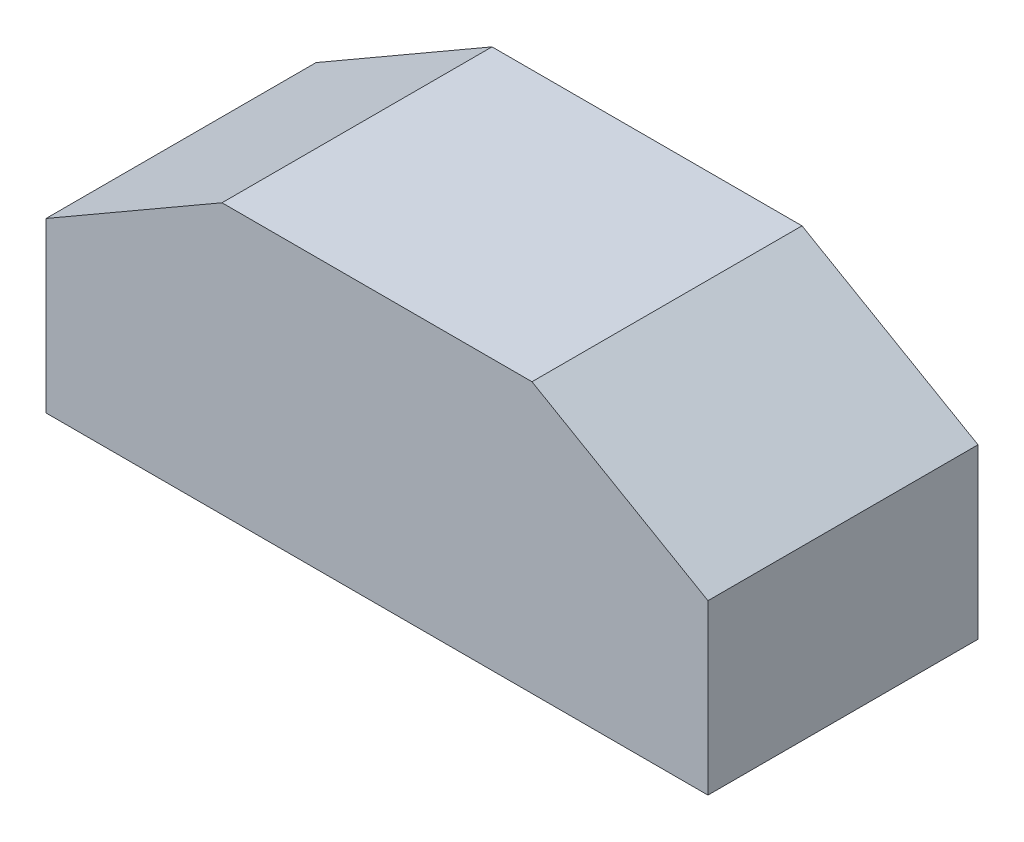
ISO-10303-21;
HEADER;
FILE_DESCRIPTION(('STEP AP214'),'2;1');
FILE_NAME('part.step','',(''),(''),'','','');
FILE_SCHEMA(('AUTOMOTIVE_DESIGN { 1 0 10303 214 1 1 1 1 }'));
ENDSEC;
DATA;
#1=APPLICATION_CONTEXT('core data for automotive mechanical design processes');
#2=APPLICATION_PROTOCOL_DEFINITION('international standard','automotive_design',2000,#1);
#3=PRODUCT_CONTEXT('',#1,'mechanical');
#4=PRODUCT('Part','Part','',(#3));
#5=PRODUCT_RELATED_PRODUCT_CATEGORY('part','',(#4));
#6=PRODUCT_DEFINITION_FORMATION('','',#4);
#7=PRODUCT_DEFINITION_CONTEXT('part definition',#1,'design');
#8=PRODUCT_DEFINITION('design','',#6,#7);
#9=PRODUCT_DEFINITION_SHAPE('','',#8);
#10=(LENGTH_UNIT() NAMED_UNIT(*) SI_UNIT(.MILLI.,.METRE.));
#11=(NAMED_UNIT(*) PLANE_ANGLE_UNIT() SI_UNIT($,.RADIAN.));
#12=(NAMED_UNIT(*) SI_UNIT($,.STERADIAN.) SOLID_ANGLE_UNIT());
#13=UNCERTAINTY_MEASURE_WITH_UNIT(LENGTH_MEASURE(1.E-05),#10,'distance_accuracy_value','');
#14=(GEOMETRIC_REPRESENTATION_CONTEXT(3) GLOBAL_UNCERTAINTY_ASSIGNED_CONTEXT((#13)) GLOBAL_UNIT_ASSIGNED_CONTEXT((#10,
#11,#12)) REPRESENTATION_CONTEXT('',''));
#15=CARTESIAN_POINT('',(0.,0.,0.));
#16=DIRECTION('',(0.,0.,1.));
#17=DIRECTION('',(1.,0.,0.));
#18=AXIS2_PLACEMENT_3D('',#15,#16,#17);
#19=CARTESIAN_POINT('',(3.74999999999992,6.49519052838325,10.));
#20=DIRECTION('',(0.499999999999995,0.866025403784442,0.));
#21=DIRECTION('',(-0.866025403784442,0.499999999999995,0.));
#22=AXIS2_PLACEMENT_3D('',#19,#20,#21);
#23=PLANE('',#22);
#24=DIRECTION('',(0.866025403784442,-0.499999999999995,0.));
#25=VECTOR('',#24,1.);
#26=CARTESIAN_POINT('',(3.74999999999992,6.49519052838325,0.));
#27=LINE('',#26,#25);
#28=CARTESIAN_POINT('',(15.,0.,0.));
#29=VERTEX_POINT('',#28);
#30=CARTESIAN_POINT('',(23.6602540378444,-4.99999999999995,0.));
#31=VERTEX_POINT('',#30);
#32=EDGE_CURVE('E163',#29,#31,#27,.T.);
#33=ORIENTED_EDGE('',*,*,#32,.T.);
#34=DIRECTION('',(0.,0.,-1.));
#35=VECTOR('',#34,1.);
#36=CARTESIAN_POINT('',(23.6602540378444,-4.99999999999995,10.));
#37=LINE('',#36,#35);
#38=CARTESIAN_POINT('',(23.6602540378444,-4.99999999999995,10.));
#39=VERTEX_POINT('',#38);
#40=EDGE_CURVE('E11',#39,#31,#37,.T.);
#41=ORIENTED_EDGE('',*,*,#40,.F.);
#42=DIRECTION('',(0.866025403784442,-0.499999999999995,0.));
#43=VECTOR('',#42,1.);
#44=CARTESIAN_POINT('',(3.74999999999992,6.49519052838325,10.));
#45=LINE('',#44,#43);
#46=CARTESIAN_POINT('',(15.,0.,10.));
#47=VERTEX_POINT('',#46);
#48=EDGE_CURVE('E64',#47,#39,#45,.T.);
#49=ORIENTED_EDGE('',*,*,#48,.F.);
#50=DIRECTION('',(0.,0.,-1.));
#51=VECTOR('',#50,1.);
#52=CARTESIAN_POINT('',(15.,0.,10.));
#53=LINE('',#52,#51);
#54=EDGE_CURVE('E171',#47,#29,#53,.T.);
#55=ORIENTED_EDGE('',*,*,#54,.T.);
#56=EDGE_LOOP('',(#33,#41,#49,#55));
#57=FACE_BOUND('',#56,.T.);
#58=ADVANCED_FACE('F35',(#57),#23,.F.);
#59=CARTESIAN_POINT('',(4.74999999999991,8.22724133595213,10.));
#60=DIRECTION('',(0.499999999999995,0.866025403784442,0.));
#61=DIRECTION('',(-0.866025403784442,0.499999999999995,0.));
#62=AXIS2_PLACEMENT_3D('',#59,#60,#61);
#63=PLANE('',#62);
#64=DIRECTION('',(0.,0.,-1.));
#65=VECTOR('',#64,1.);
#66=CARTESIAN_POINT('',(24.6602540378444,-3.26794919243107,10.));
#67=LINE('',#66,#65);
#68=CARTESIAN_POINT('',(24.6602540378444,-3.26794919243107,12.));
#69=VERTEX_POINT('',#68);
#70=CARTESIAN_POINT('',(24.6602540378444,-3.26794919243107,-2.));
#71=VERTEX_POINT('',#70);
#72=EDGE_CURVE('E43',#69,#71,#67,.T.);
#73=ORIENTED_EDGE('',*,*,#72,.T.);
#74=DIRECTION('',(0.866025403784442,-0.499999999999995,0.));
#75=VECTOR('',#74,1.);
#76=CARTESIAN_POINT('',(24.6602540378444,-3.26794919243107,-2.));
#77=LINE('',#76,#75);
#78=CARTESIAN_POINT('',(15.5358983848622,2.,-2.));
#79=VERTEX_POINT('',#78);
#80=EDGE_CURVE('E153',#79,#71,#77,.T.);
#81=ORIENTED_EDGE('',*,*,#80,.F.);
#82=DIRECTION('',(0.,0.,-1.));
#83=VECTOR('',#82,1.);
#84=CARTESIAN_POINT('',(15.5358983848622,2.,10.));
#85=LINE('',#84,#83);
#86=CARTESIAN_POINT('',(15.5358983848622,2.,12.));
#87=VERTEX_POINT('',#86);
#88=EDGE_CURVE('E141',#87,#79,#85,.T.);
#89=ORIENTED_EDGE('',*,*,#88,.F.);
#90=DIRECTION('',(-0.866025403784442,0.499999999999995,0.));
#91=VECTOR('',#90,1.);
#92=CARTESIAN_POINT('',(4.74999999999991,8.22724133595213,12.));
#93=LINE('',#92,#91);
#94=EDGE_CURVE('E145',#69,#87,#93,.T.);
#95=ORIENTED_EDGE('',*,*,#94,.F.);
#96=EDGE_LOOP('',(#73,#81,#89,#95));
#97=FACE_BOUND('',#96,.T.);
#98=ADVANCED_FACE('F151',(#97),#63,.T.);
#99=CARTESIAN_POINT('',(0.,2.,10.));
#100=DIRECTION('',(0.,1.,0.));
#101=DIRECTION('',(0.,0.,1.));
#102=AXIS2_PLACEMENT_3D('',#99,#100,#101);
#103=PLANE('',#102);
#104=ORIENTED_EDGE('',*,*,#88,.T.);
#105=DIRECTION('',(1.,0.,0.));
#106=VECTOR('',#105,1.);
#107=CARTESIAN_POINT('',(15.5358983848622,2.,-2.));
#108=LINE('',#107,#106);
#109=CARTESIAN_POINT('',(-0.535898384862239,2.,-2.));
#110=VERTEX_POINT('',#109);
#111=EDGE_CURVE('E157',#110,#79,#108,.T.);
#112=ORIENTED_EDGE('',*,*,#111,.F.);
#113=DIRECTION('',(0.,0.,-1.));
#114=VECTOR('',#113,1.);
#115=CARTESIAN_POINT('',(-0.535898384862239,2.,10.));
#116=LINE('',#115,#114);
#117=CARTESIAN_POINT('',(-0.535898384862239,2.,12.));
#118=VERTEX_POINT('',#117);
#119=EDGE_CURVE('E72',#118,#110,#116,.T.);
#120=ORIENTED_EDGE('',*,*,#119,.F.);
#121=DIRECTION('',(-1.,0.,0.));
#122=VECTOR('',#121,1.);
#123=CARTESIAN_POINT('',(0.,2.,12.));
#124=LINE('',#123,#122);
#125=EDGE_CURVE('E152',#87,#118,#124,.T.);
#126=ORIENTED_EDGE('',*,*,#125,.F.);
#127=EDGE_LOOP('',(#104,#112,#120,#126));
#128=FACE_BOUND('',#127,.T.);
#129=ADVANCED_FACE('F187',(#128),#103,.T.);
#130=CARTESIAN_POINT('',(-0.99999999999999,1.73205080756888,10.));
#131=DIRECTION('',(0.499999999999995,-0.866025403784442,0.));
#132=DIRECTION('',(0.866025403784442,0.499999999999995,0.));
#133=AXIS2_PLACEMENT_3D('',#130,#131,#132);
#134=PLANE('',#133);
#135=ORIENTED_EDGE('',*,*,#119,.T.);
#136=DIRECTION('',(0.866025403784442,0.499999999999995,0.));
#137=VECTOR('',#136,1.);
#138=CARTESIAN_POINT('',(-0.535898384862239,2.,-2.));
#139=LINE('',#138,#137);
#140=CARTESIAN_POINT('',(-9.66025403784441,-3.26794919243107,-2.));
#141=VERTEX_POINT('',#140);
#142=EDGE_CURVE('E193',#141,#110,#139,.T.);
#143=ORIENTED_EDGE('',*,*,#142,.F.);
#144=DIRECTION('',(0.,0.,-1.));
#145=VECTOR('',#144,1.);
#146=CARTESIAN_POINT('',(-9.66025403784441,-3.26794919243107,10.));
#147=LINE('',#146,#145);
#148=CARTESIAN_POINT('',(-9.66025403784441,-3.26794919243107,12.));
#149=VERTEX_POINT('',#148);
#150=EDGE_CURVE('E183',#149,#141,#147,.T.);
#151=ORIENTED_EDGE('',*,*,#150,.F.);
#152=DIRECTION('',(-0.866025403784442,-0.499999999999995,0.));
#153=VECTOR('',#152,1.);
#154=CARTESIAN_POINT('',(-0.99999999999999,1.73205080756888,12.));
#155=LINE('',#154,#153);
#156=EDGE_CURVE('E155',#118,#149,#155,.T.);
#157=ORIENTED_EDGE('',*,*,#156,.F.);
#158=EDGE_LOOP('',(#135,#143,#151,#157));
#159=FACE_BOUND('',#158,.T.);
#160=ADVANCED_FACE('F237',(#159),#134,.F.);
#161=CARTESIAN_POINT('',(0.,0.,10.));
#162=DIRECTION('',(0.499999999999995,-0.866025403784442,0.));
#163=DIRECTION('',(0.866025403784442,0.499999999999995,0.));
#164=AXIS2_PLACEMENT_3D('',#161,#162,#163);
#165=PLANE('',#164);
#166=DIRECTION('',(-0.866025403784442,-0.499999999999995,0.));
#167=VECTOR('',#166,1.);
#168=CARTESIAN_POINT('',(0.,0.,0.));
#169=LINE('',#168,#167);
#170=CARTESIAN_POINT('',(0.,0.,0.));
#171=VERTEX_POINT('',#170);
#172=CARTESIAN_POINT('',(-8.66025403784441,-4.99999999999995,0.));
#173=VERTEX_POINT('',#172);
#174=EDGE_CURVE('E174',#171,#173,#169,.T.);
#175=ORIENTED_EDGE('',*,*,#174,.F.);
#176=DIRECTION('',(0.,0.,-1.));
#177=VECTOR('',#176,1.);
#178=CARTESIAN_POINT('',(0.,0.,10.));
#179=LINE('',#178,#177);
#180=CARTESIAN_POINT('',(0.,0.,10.));
#181=VERTEX_POINT('',#180);
#182=EDGE_CURVE('E50',#181,#171,#179,.T.);
#183=ORIENTED_EDGE('',*,*,#182,.F.);
#184=DIRECTION('',(-0.866025403784442,-0.499999999999995,0.));
#185=VECTOR('',#184,1.);
#186=CARTESIAN_POINT('',(0.,0.,10.));
#187=LINE('',#186,#185);
#188=CARTESIAN_POINT('',(-8.66025403784441,-4.99999999999995,10.));
#189=VERTEX_POINT('',#188);
#190=EDGE_CURVE('E165',#181,#189,#187,.T.);
#191=ORIENTED_EDGE('',*,*,#190,.T.);
#192=DIRECTION('',(0.,0.,-1.));
#193=VECTOR('',#192,1.);
#194=CARTESIAN_POINT('',(-8.66025403784441,-4.99999999999995,10.));
#195=LINE('',#194,#193);
#196=EDGE_CURVE('E180',#189,#173,#195,.T.);
#197=ORIENTED_EDGE('',*,*,#196,.T.);
#198=EDGE_LOOP('',(#175,#183,#191,#197));
#199=FACE_BOUND('',#198,.T.);
#200=ADVANCED_FACE('F239',(#199),#165,.T.);
#201=CARTESIAN_POINT('',(0.,0.,10.));
#202=DIRECTION('',(0.,1.,0.));
#203=DIRECTION('',(0.,0.,1.));
#204=AXIS2_PLACEMENT_3D('',#201,#202,#203);
#205=PLANE('',#204);
#206=DIRECTION('',(1.,0.,0.));
#207=VECTOR('',#206,1.);
#208=CARTESIAN_POINT('',(0.,0.,0.));
#209=LINE('',#208,#207);
#210=EDGE_CURVE('E166',#171,#29,#209,.T.);
#211=ORIENTED_EDGE('',*,*,#210,.T.);
#212=ORIENTED_EDGE('',*,*,#54,.F.);
#213=DIRECTION('',(1.,0.,0.));
#214=VECTOR('',#213,1.);
#215=CARTESIAN_POINT('',(0.,0.,10.));
#216=LINE('',#215,#214);
#217=EDGE_CURVE('E168',#181,#47,#216,.T.);
#218=ORIENTED_EDGE('',*,*,#217,.F.);
#219=ORIENTED_EDGE('',*,*,#182,.T.);
#220=EDGE_LOOP('',(#211,#212,#218,#219));
#221=FACE_BOUND('',#220,.T.);
#222=ADVANCED_FACE('F245',(#221),#205,.F.);
#223=CARTESIAN_POINT('',(0.,0.,10.));
#224=DIRECTION('',(0.,0.,1.));
#225=DIRECTION('',(1.,0.,0.));
#226=AXIS2_PLACEMENT_3D('',#223,#224,#225);
#227=PLANE('',#226);
#228=ORIENTED_EDGE('',*,*,#217,.T.);
#229=ORIENTED_EDGE('',*,*,#48,.T.);
#230=DIRECTION('',(0.,1.,0.));
#231=VECTOR('',#230,1.);
#232=CARTESIAN_POINT('',(23.6602540378444,-4.99999999999995,10.));
#233=LINE('',#232,#231);
#234=CARTESIAN_POINT('',(23.6602540378444,-11.9999999999999,10.));
#235=VERTEX_POINT('',#234);
#236=EDGE_CURVE('E194',#235,#39,#233,.T.);
#237=ORIENTED_EDGE('',*,*,#236,.F.);
#238=DIRECTION('',(1.,0.,0.));
#239=VECTOR('',#238,1.);
#240=CARTESIAN_POINT('',(-8.66025403784441,-11.9999999999999,10.));
#241=LINE('',#240,#239);
#242=CARTESIAN_POINT('',(-8.66025403784441,-11.9999999999999,10.));
#243=VERTEX_POINT('',#242);
#244=EDGE_CURVE('E201',#243,#235,#241,.T.);
#245=ORIENTED_EDGE('',*,*,#244,.F.);
#246=DIRECTION('',(0.,-1.,0.));
#247=VECTOR('',#246,1.);
#248=CARTESIAN_POINT('',(-8.66025403784441,-4.99999999999995,10.));
#249=LINE('',#248,#247);
#250=EDGE_CURVE('E198',#189,#243,#249,.T.);
#251=ORIENTED_EDGE('',*,*,#250,.F.);
#252=ORIENTED_EDGE('',*,*,#190,.F.);
#253=EDGE_LOOP('',(#228,#229,#237,#245,#251,#252));
#254=FACE_BOUND('',#253,.T.);
#255=ADVANCED_FACE('F265',(#254),#227,.F.);
#256=CARTESIAN_POINT('',(0.,0.,12.));
#257=DIRECTION('',(0.,0.,1.));
#258=DIRECTION('',(1.,0.,0.));
#259=AXIS2_PLACEMENT_3D('',#256,#257,#258);
#260=PLANE('',#259);
#261=DIRECTION('',(0.,-1.,0.));
#262=VECTOR('',#261,1.);
#263=CARTESIAN_POINT('',(24.6602540378444,-3.26794919243107,12.));
#264=LINE('',#263,#262);
#265=CARTESIAN_POINT('',(24.6602540378444,-11.9999999999999,12.));
#266=VERTEX_POINT('',#265);
#267=EDGE_CURVE('E134',#69,#266,#264,.T.);
#268=ORIENTED_EDGE('',*,*,#267,.F.);
#269=ORIENTED_EDGE('',*,*,#94,.T.);
#270=ORIENTED_EDGE('',*,*,#125,.T.);
#271=ORIENTED_EDGE('',*,*,#156,.T.);
#272=DIRECTION('',(0.,-1.,0.));
#273=VECTOR('',#272,1.);
#274=CARTESIAN_POINT('',(-9.66025403784441,-3.26794919243107,12.));
#275=LINE('',#274,#273);
#276=CARTESIAN_POINT('',(-9.6602540378444,-11.9999999999999,12.));
#277=VERTEX_POINT('',#276);
#278=EDGE_CURVE('E220',#149,#277,#275,.T.);
#279=ORIENTED_EDGE('',*,*,#278,.T.);
#280=DIRECTION('',(1.,0.,0.));
#281=VECTOR('',#280,1.);
#282=CARTESIAN_POINT('',(-8.66025403784441,-11.9999999999999,12.));
#283=LINE('',#282,#281);
#284=EDGE_CURVE('E147',#277,#266,#283,.T.);
#285=ORIENTED_EDGE('',*,*,#284,.T.);
#286=EDGE_LOOP('',(#268,#269,#270,#271,#279,#285));
#287=FACE_BOUND('',#286,.T.);
#288=ADVANCED_FACE('F144',(#287),#260,.T.);
#289=CARTESIAN_POINT('',(0.,0.,0.));
#290=DIRECTION('',(0.,0.,1.));
#291=DIRECTION('',(1.,0.,0.));
#292=AXIS2_PLACEMENT_3D('',#289,#290,#291);
#293=PLANE('',#292);
#294=ORIENTED_EDGE('',*,*,#32,.F.);
#295=ORIENTED_EDGE('',*,*,#210,.F.);
#296=ORIENTED_EDGE('',*,*,#174,.T.);
#297=DIRECTION('',(0.,1.,0.));
#298=VECTOR('',#297,1.);
#299=CARTESIAN_POINT('',(-8.66025403784441,-4.99999999999995,0.));
#300=LINE('',#299,#298);
#301=CARTESIAN_POINT('',(-8.66025403784441,-11.9999999999999,0.));
#302=VERTEX_POINT('',#301);
#303=EDGE_CURVE('E199',#302,#173,#300,.T.);
#304=ORIENTED_EDGE('',*,*,#303,.F.);
#305=DIRECTION('',(-1.,0.,0.));
#306=VECTOR('',#305,1.);
#307=CARTESIAN_POINT('',(-8.66025403784441,-11.9999999999999,0.));
#308=LINE('',#307,#306);
#309=CARTESIAN_POINT('',(23.6602540378444,-11.9999999999999,0.));
#310=VERTEX_POINT('',#309);
#311=EDGE_CURVE('E210',#310,#302,#308,.T.);
#312=ORIENTED_EDGE('',*,*,#311,.F.);
#313=DIRECTION('',(0.,-1.,0.));
#314=VECTOR('',#313,1.);
#315=CARTESIAN_POINT('',(23.6602540378444,-11.9999999999999,0.));
#316=LINE('',#315,#314);
#317=EDGE_CURVE('E207',#31,#310,#316,.T.);
#318=ORIENTED_EDGE('',*,*,#317,.F.);
#319=EDGE_LOOP('',(#294,#295,#296,#304,#312,#318));
#320=FACE_BOUND('',#319,.T.);
#321=ADVANCED_FACE('F256',(#320),#293,.T.);
#322=CARTESIAN_POINT('',(0.,0.,-2.));
#323=DIRECTION('',(0.,0.,1.));
#324=DIRECTION('',(1.,0.,0.));
#325=AXIS2_PLACEMENT_3D('',#322,#323,#324);
#326=PLANE('',#325);
#327=DIRECTION('',(0.,-1.,0.));
#328=VECTOR('',#327,1.);
#329=CARTESIAN_POINT('',(-9.66025403784441,-3.26794919243107,-2.));
#330=LINE('',#329,#328);
#331=CARTESIAN_POINT('',(-9.6602540378444,-11.9999999999999,-2.));
#332=VERTEX_POINT('',#331);
#333=EDGE_CURVE('E217',#141,#332,#330,.T.);
#334=ORIENTED_EDGE('',*,*,#333,.F.);
#335=ORIENTED_EDGE('',*,*,#142,.T.);
#336=ORIENTED_EDGE('',*,*,#111,.T.);
#337=ORIENTED_EDGE('',*,*,#80,.T.);
#338=DIRECTION('',(0.,-1.,0.));
#339=VECTOR('',#338,1.);
#340=CARTESIAN_POINT('',(24.6602540378444,-3.26794919243107,-2.));
#341=LINE('',#340,#339);
#342=CARTESIAN_POINT('',(24.6602540378444,-11.9999999999999,-2.));
#343=VERTEX_POINT('',#342);
#344=EDGE_CURVE('E136',#71,#343,#341,.T.);
#345=ORIENTED_EDGE('',*,*,#344,.T.);
#346=DIRECTION('',(-1.,0.,0.));
#347=VECTOR('',#346,1.);
#348=CARTESIAN_POINT('',(-8.66025403784441,-11.9999999999999,-2.));
#349=LINE('',#348,#347);
#350=EDGE_CURVE('E205',#343,#332,#349,.T.);
#351=ORIENTED_EDGE('',*,*,#350,.T.);
#352=EDGE_LOOP('',(#334,#335,#336,#337,#345,#351));
#353=FACE_BOUND('',#352,.T.);
#354=ADVANCED_FACE('F191',(#353),#326,.F.);
#355=CARTESIAN_POINT('',(-8.66025403784441,-11.9999999999999,10.));
#356=DIRECTION('',(0.,-1.,0.));
#357=DIRECTION('',(0.,0.,-1.));
#358=AXIS2_PLACEMENT_3D('',#355,#356,#357);
#359=PLANE('',#358);
#360=DIRECTION('',(0.,0.,-1.));
#361=VECTOR('',#360,1.);
#362=CARTESIAN_POINT('',(24.6602540378444,-11.9999999999999,12.));
#363=LINE('',#362,#361);
#364=EDGE_CURVE('E222',#266,#343,#363,.T.);
#365=ORIENTED_EDGE('',*,*,#364,.F.);
#366=ORIENTED_EDGE('',*,*,#284,.F.);
#367=DIRECTION('',(0.,0.,1.));
#368=VECTOR('',#367,1.);
#369=CARTESIAN_POINT('',(-9.6602540378444,-11.9999999999999,-2.));
#370=LINE('',#369,#368);
#371=EDGE_CURVE('E214',#332,#277,#370,.T.);
#372=ORIENTED_EDGE('',*,*,#371,.F.);
#373=ORIENTED_EDGE('',*,*,#350,.F.);
#374=EDGE_LOOP('',(#365,#366,#372,#373));
#375=FACE_BOUND('',#374,.T.);
#376=ORIENTED_EDGE('',*,*,#244,.T.);
#377=DIRECTION('',(0.,0.,-1.));
#378=VECTOR('',#377,1.);
#379=CARTESIAN_POINT('',(23.6602540378444,-11.9999999999999,12.));
#380=LINE('',#379,#378);
#381=EDGE_CURVE('E149',#235,#310,#380,.T.);
#382=ORIENTED_EDGE('',*,*,#381,.T.);
#383=ORIENTED_EDGE('',*,*,#311,.T.);
#384=DIRECTION('',(0.,0.,1.));
#385=VECTOR('',#384,1.);
#386=CARTESIAN_POINT('',(-8.66025403784441,-11.9999999999999,-2.));
#387=LINE('',#386,#385);
#388=EDGE_CURVE('E208',#302,#243,#387,.T.);
#389=ORIENTED_EDGE('',*,*,#388,.T.);
#390=EDGE_LOOP('',(#376,#382,#383,#389));
#391=FACE_BOUND('',#390,.T.);
#392=ADVANCED_FACE('F230',(#375,#391),#359,.T.);
#393=CARTESIAN_POINT('',(-8.66025403784441,-11.9999999999999,-2.));
#394=DIRECTION('',(1.,0.,0.));
#395=DIRECTION('',(0.,0.,-1.));
#396=AXIS2_PLACEMENT_3D('',#393,#394,#395);
#397=PLANE('',#396);
#398=ORIENTED_EDGE('',*,*,#250,.T.);
#399=ORIENTED_EDGE('',*,*,#388,.F.);
#400=ORIENTED_EDGE('',*,*,#303,.T.);
#401=ORIENTED_EDGE('',*,*,#196,.F.);
#402=EDGE_LOOP('',(#398,#399,#400,#401));
#403=FACE_BOUND('',#402,.T.);
#404=ADVANCED_FACE('F282',(#403),#397,.T.);
#405=CARTESIAN_POINT('',(-9.66025403784441,-3.26794919243107,-2.));
#406=DIRECTION('',(-1.,0.,0.));
#407=DIRECTION('',(0.,-1.,0.));
#408=AXIS2_PLACEMENT_3D('',#405,#406,#407);
#409=PLANE('',#408);
#410=ORIENTED_EDGE('',*,*,#278,.F.);
#411=ORIENTED_EDGE('',*,*,#150,.T.);
#412=ORIENTED_EDGE('',*,*,#333,.T.);
#413=ORIENTED_EDGE('',*,*,#371,.T.);
#414=EDGE_LOOP('',(#410,#411,#412,#413));
#415=FACE_BOUND('',#414,.T.);
#416=ADVANCED_FACE('F233',(#415),#409,.T.);
#417=CARTESIAN_POINT('',(23.6602540378444,-4.99999999999995,12.));
#418=DIRECTION('',(1.,0.,0.));
#419=DIRECTION('',(0.,0.,-1.));
#420=AXIS2_PLACEMENT_3D('',#417,#418,#419);
#421=PLANE('',#420);
#422=ORIENTED_EDGE('',*,*,#381,.F.);
#423=ORIENTED_EDGE('',*,*,#236,.T.);
#424=ORIENTED_EDGE('',*,*,#40,.T.);
#425=ORIENTED_EDGE('',*,*,#317,.T.);
#426=EDGE_LOOP('',(#422,#423,#424,#425));
#427=FACE_BOUND('',#426,.T.);
#428=ADVANCED_FACE('F260',(#427),#421,.F.);
#429=CARTESIAN_POINT('',(24.6602540378444,-3.26794919243107,12.));
#430=DIRECTION('',(1.,0.,0.));
#431=DIRECTION('',(0.,0.,-1.));
#432=AXIS2_PLACEMENT_3D('',#429,#430,#431);
#433=PLANE('',#432);
#434=ORIENTED_EDGE('',*,*,#344,.F.);
#435=ORIENTED_EDGE('',*,*,#72,.F.);
#436=ORIENTED_EDGE('',*,*,#267,.T.);
#437=ORIENTED_EDGE('',*,*,#364,.T.);
#438=EDGE_LOOP('',(#434,#435,#436,#437));
#439=FACE_BOUND('',#438,.T.);
#440=ADVANCED_FACE('F132',(#439),#433,.T.);
#441=CLOSED_SHELL('',(#58,#98,#129,#160,#200,#222,#255,#288,#321,#354,#392,#404,#416,#428,#440));
#442=MANIFOLD_SOLID_BREP('B2',#441);
#443=ADVANCED_BREP_SHAPE_REPRESENTATION('',(#18,#442),#14);
#444=SHAPE_DEFINITION_REPRESENTATION(#9,#443);
ENDSEC;
END-ISO-10303-21;
